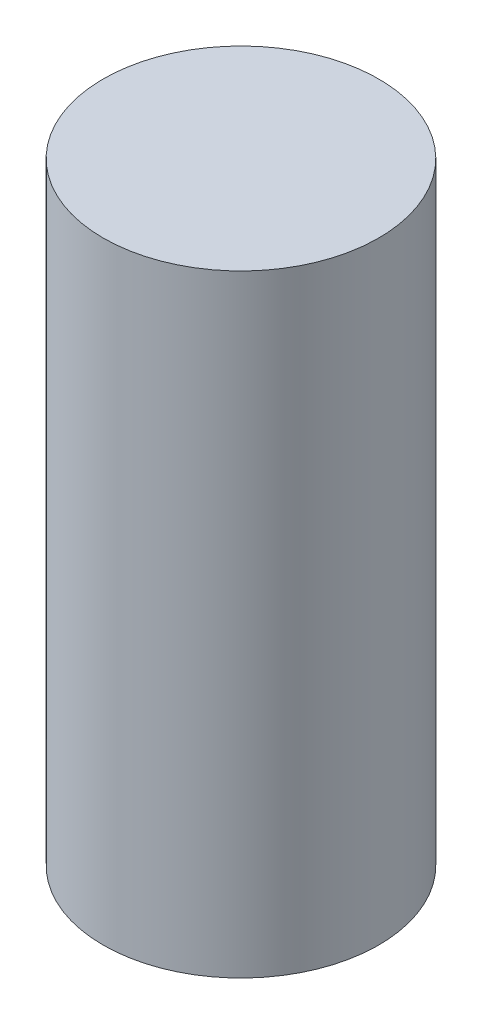
ISO-10303-21;
HEADER;
FILE_DESCRIPTION(('STEP AP214'),'2;1');
FILE_NAME('part.step','',(''),(''),'','','');
FILE_SCHEMA(('AUTOMOTIVE_DESIGN { 1 0 10303 214 1 1 1 1 }'));
ENDSEC;
DATA;
#1=APPLICATION_CONTEXT('core data for automotive mechanical design processes');
#2=APPLICATION_PROTOCOL_DEFINITION('international standard','automotive_design',2000,#1);
#3=PRODUCT_CONTEXT('',#1,'mechanical');
#4=PRODUCT('Part','Part','',(#3));
#5=PRODUCT_RELATED_PRODUCT_CATEGORY('part','',(#4));
#6=PRODUCT_DEFINITION_FORMATION('','',#4);
#7=PRODUCT_DEFINITION_CONTEXT('part definition',#1,'design');
#8=PRODUCT_DEFINITION('design','',#6,#7);
#9=PRODUCT_DEFINITION_SHAPE('','',#8);
#10=(LENGTH_UNIT() NAMED_UNIT(*) SI_UNIT(.MILLI.,.METRE.));
#11=(NAMED_UNIT(*) PLANE_ANGLE_UNIT() SI_UNIT($,.RADIAN.));
#12=(NAMED_UNIT(*) SI_UNIT($,.STERADIAN.) SOLID_ANGLE_UNIT());
#13=UNCERTAINTY_MEASURE_WITH_UNIT(LENGTH_MEASURE(1.E-05),#10,'distance_accuracy_value','');
#14=(GEOMETRIC_REPRESENTATION_CONTEXT(3) GLOBAL_UNCERTAINTY_ASSIGNED_CONTEXT((#13)) GLOBAL_UNIT_ASSIGNED_CONTEXT((#10,
#11,#12)) REPRESENTATION_CONTEXT('',''));
#15=CARTESIAN_POINT('',(0.,0.,0.));
#16=DIRECTION('',(0.,0.,1.));
#17=DIRECTION('',(1.,0.,0.));
#18=AXIS2_PLACEMENT_3D('',#15,#16,#17);
#19=CARTESIAN_POINT('',(0.,11.,0.));
#20=DIRECTION('',(0.,-1.,0.));
#21=DIRECTION('',(0.,0.,-1.));
#22=AXIS2_PLACEMENT_3D('',#19,#20,#21);
#23=CYLINDRICAL_SURFACE('',#22,2.475);
#24=CARTESIAN_POINT('',(0.,11.,0.));
#25=DIRECTION('',(0.,1.,0.));
#26=DIRECTION('',(0.,0.,1.));
#27=AXIS2_PLACEMENT_3D('',#24,#25,#26);
#28=CIRCLE('',#27,2.475);
#29=CARTESIAN_POINT('',(0.,11.,2.475));
#30=VERTEX_POINT('',#29);
#31=EDGE_CURVE('E10',#30,#30,#28,.T.);
#32=ORIENTED_EDGE('',*,*,#31,.F.);
#33=EDGE_LOOP('',(#32));
#34=FACE_BOUND('',#33,.T.);
#35=CARTESIAN_POINT('',(0.,0.,0.));
#36=DIRECTION('',(0.,1.,0.));
#37=DIRECTION('',(0.,0.,1.));
#38=AXIS2_PLACEMENT_3D('',#35,#36,#37);
#39=CIRCLE('',#38,2.475);
#40=CARTESIAN_POINT('',(0.,0.,2.475));
#41=VERTEX_POINT('',#40);
#42=EDGE_CURVE('E46',#41,#41,#39,.T.);
#43=ORIENTED_EDGE('',*,*,#42,.T.);
#44=EDGE_LOOP('',(#43));
#45=FACE_BOUND('',#44,.T.);
#46=ADVANCED_FACE('F43',(#34,#45),#23,.T.);
#47=CARTESIAN_POINT('',(0.,11.,0.));
#48=DIRECTION('',(0.,1.,0.));
#49=DIRECTION('',(0.,0.,1.));
#50=AXIS2_PLACEMENT_3D('',#47,#48,#49);
#51=PLANE('',#50);
#52=ORIENTED_EDGE('',*,*,#31,.T.);
#53=EDGE_LOOP('',(#52));
#54=FACE_BOUND('',#53,.T.);
#55=ADVANCED_FACE('F60',(#54),#51,.T.);
#56=CARTESIAN_POINT('',(0.,0.,0.));
#57=DIRECTION('',(0.,1.,0.));
#58=DIRECTION('',(0.,0.,1.));
#59=AXIS2_PLACEMENT_3D('',#56,#57,#58);
#60=PLANE('',#59);
#61=ORIENTED_EDGE('',*,*,#42,.F.);
#62=EDGE_LOOP('',(#61));
#63=FACE_BOUND('',#62,.T.);
#64=ADVANCED_FACE('F58',(#63),#60,.F.);
#65=CLOSED_SHELL('',(#46,#55,#64));
#66=MANIFOLD_SOLID_BREP('B2',#65);
#67=ADVANCED_BREP_SHAPE_REPRESENTATION('',(#18,#66),#14);
#68=SHAPE_DEFINITION_REPRESENTATION(#9,#67);
ENDSEC;
END-ISO-10303-21;
